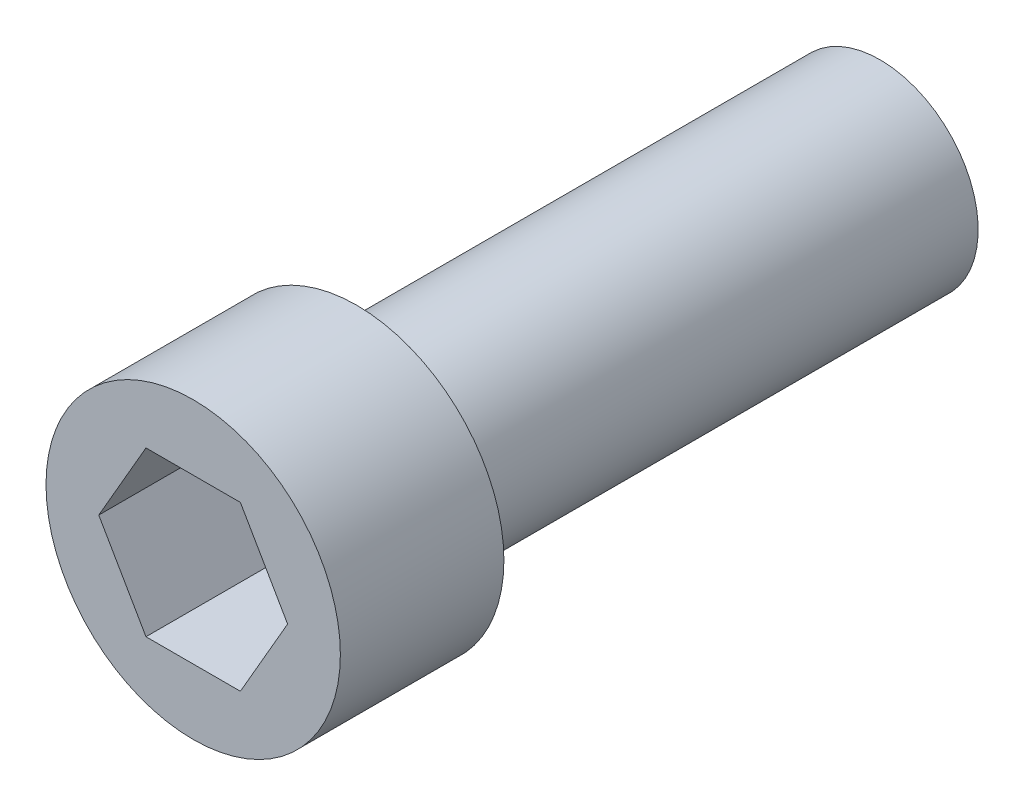
ISO-10303-21;
HEADER;
FILE_DESCRIPTION(('STEP AP214'),'2;1');
FILE_NAME('part.step','',(''),(''),'','','');
FILE_SCHEMA(('AUTOMOTIVE_DESIGN { 1 0 10303 214 1 1 1 1 }'));
ENDSEC;
DATA;
#1=APPLICATION_CONTEXT('core data for automotive mechanical design processes');
#2=APPLICATION_PROTOCOL_DEFINITION('international standard','automotive_design',2000,#1);
#3=PRODUCT_CONTEXT('',#1,'mechanical');
#4=PRODUCT('Part','Part','',(#3));
#5=PRODUCT_RELATED_PRODUCT_CATEGORY('part','',(#4));
#6=PRODUCT_DEFINITION_FORMATION('','',#4);
#7=PRODUCT_DEFINITION_CONTEXT('part definition',#1,'design');
#8=PRODUCT_DEFINITION('design','',#6,#7);
#9=PRODUCT_DEFINITION_SHAPE('','',#8);
#10=(LENGTH_UNIT() NAMED_UNIT(*) SI_UNIT(.MILLI.,.METRE.));
#11=(NAMED_UNIT(*) PLANE_ANGLE_UNIT() SI_UNIT($,.RADIAN.));
#12=(NAMED_UNIT(*) SI_UNIT($,.STERADIAN.) SOLID_ANGLE_UNIT());
#13=UNCERTAINTY_MEASURE_WITH_UNIT(LENGTH_MEASURE(1.E-05),#10,'distance_accuracy_value','');
#14=(GEOMETRIC_REPRESENTATION_CONTEXT(3) GLOBAL_UNCERTAINTY_ASSIGNED_CONTEXT((#13)) GLOBAL_UNIT_ASSIGNED_CONTEXT((#10,
#11,#12)) REPRESENTATION_CONTEXT('',''));
#15=CARTESIAN_POINT('',(0.,0.,0.));
#16=DIRECTION('',(0.,0.,1.));
#17=DIRECTION('',(1.,0.,0.));
#18=AXIS2_PLACEMENT_3D('',#15,#16,#17);
#19=CARTESIAN_POINT('',(0.,0.,2.5));
#20=DIRECTION('',(0.,0.,-1.));
#21=DIRECTION('',(-1.,0.,0.));
#22=AXIS2_PLACEMENT_3D('',#19,#20,#21);
#23=CYLINDRICAL_SURFACE('',#22,2.25);
#24=CARTESIAN_POINT('',(0.,0.,2.5));
#25=DIRECTION('',(0.,0.,1.));
#26=DIRECTION('',(1.,0.,0.));
#27=AXIS2_PLACEMENT_3D('',#24,#25,#26);
#28=CIRCLE('',#27,2.25);
#29=CARTESIAN_POINT('',(2.25,0.,2.5));
#30=VERTEX_POINT('',#29);
#31=EDGE_CURVE('E50',#30,#30,#28,.T.);
#32=ORIENTED_EDGE('',*,*,#31,.F.);
#33=EDGE_LOOP('',(#32));
#34=FACE_BOUND('',#33,.T.);
#35=CARTESIAN_POINT('',(0.,0.,0.));
#36=DIRECTION('',(0.,0.,1.));
#37=DIRECTION('',(1.,0.,0.));
#38=AXIS2_PLACEMENT_3D('',#35,#36,#37);
#39=CIRCLE('',#38,2.25);
#40=CARTESIAN_POINT('',(2.25,0.,0.));
#41=VERTEX_POINT('',#40);
#42=EDGE_CURVE('E44',#41,#41,#39,.T.);
#43=ORIENTED_EDGE('',*,*,#42,.T.);
#44=EDGE_LOOP('',(#43));
#45=FACE_BOUND('',#44,.T.);
#46=ADVANCED_FACE('F41',(#34,#45),#23,.T.);
#47=CARTESIAN_POINT('',(0.,0.,2.5));
#48=DIRECTION('',(0.,0.,1.));
#49=DIRECTION('',(1.,0.,0.));
#50=AXIS2_PLACEMENT_3D('',#47,#48,#49);
#51=PLANE('',#50);
#52=DIRECTION('',(0.499999999999999,0.866025403784439,0.));
#53=VECTOR('',#52,1.);
#54=CARTESIAN_POINT('',(0.721687836487032,-1.25,2.5));
#55=LINE('',#54,#53);
#56=CARTESIAN_POINT('',(0.721687836487032,-1.25,2.5));
#57=VERTEX_POINT('',#56);
#58=CARTESIAN_POINT('',(1.44337567297406,0.,2.5));
#59=VERTEX_POINT('',#58);
#60=EDGE_CURVE('E58',#57,#59,#55,.T.);
#61=ORIENTED_EDGE('',*,*,#60,.F.);
#62=DIRECTION('',(1.,0.,0.));
#63=VECTOR('',#62,1.);
#64=CARTESIAN_POINT('',(-0.721687836487033,-1.25,2.5));
#65=LINE('',#64,#63);
#66=CARTESIAN_POINT('',(-0.721687836487033,-1.25,2.5));
#67=VERTEX_POINT('',#66);
#68=EDGE_CURVE('E152',#67,#57,#65,.T.);
#69=ORIENTED_EDGE('',*,*,#68,.F.);
#70=DIRECTION('',(0.5,-0.866025403784439,0.));
#71=VECTOR('',#70,1.);
#72=CARTESIAN_POINT('',(-1.44337567297407,0.,2.5));
#73=LINE('',#72,#71);
#74=CARTESIAN_POINT('',(-1.44337567297407,0.,2.5));
#75=VERTEX_POINT('',#74);
#76=EDGE_CURVE('E149',#75,#67,#73,.T.);
#77=ORIENTED_EDGE('',*,*,#76,.F.);
#78=DIRECTION('',(-0.5,-0.866025403784439,0.));
#79=VECTOR('',#78,1.);
#80=CARTESIAN_POINT('',(-0.721687836487033,1.25,2.5));
#81=LINE('',#80,#79);
#82=CARTESIAN_POINT('',(-0.721687836487033,1.25,2.5));
#83=VERTEX_POINT('',#82);
#84=EDGE_CURVE('E106',#83,#75,#81,.T.);
#85=ORIENTED_EDGE('',*,*,#84,.F.);
#86=DIRECTION('',(-1.,0.,0.));
#87=VECTOR('',#86,1.);
#88=CARTESIAN_POINT('',(0.721687836487032,1.25,2.5));
#89=LINE('',#88,#87);
#90=CARTESIAN_POINT('',(0.721687836487032,1.25,2.5));
#91=VERTEX_POINT('',#90);
#92=EDGE_CURVE('E143',#91,#83,#89,.T.);
#93=ORIENTED_EDGE('',*,*,#92,.F.);
#94=DIRECTION('',(-0.5,0.866025403784439,0.));
#95=VECTOR('',#94,1.);
#96=CARTESIAN_POINT('',(1.44337567297406,0.,2.5));
#97=LINE('',#96,#95);
#98=EDGE_CURVE('E138',#59,#91,#97,.T.);
#99=ORIENTED_EDGE('',*,*,#98,.F.);
#100=EDGE_LOOP('',(#61,#69,#77,#85,#93,#99));
#101=FACE_BOUND('',#100,.T.);
#102=ORIENTED_EDGE('',*,*,#31,.T.);
#103=EDGE_LOOP('',(#102));
#104=FACE_BOUND('',#103,.T.);
#105=ADVANCED_FACE('F178',(#101,#104),#51,.T.);
#106=CARTESIAN_POINT('',(0.,0.,0.));
#107=DIRECTION('',(0.,0.,1.));
#108=DIRECTION('',(1.,0.,0.));
#109=AXIS2_PLACEMENT_3D('',#106,#107,#108);
#110=PLANE('',#109);
#111=CARTESIAN_POINT('',(0.,0.,0.));
#112=DIRECTION('',(0.,0.,-1.));
#113=DIRECTION('',(-1.,0.,0.));
#114=AXIS2_PLACEMENT_3D('',#111,#112,#113);
#115=CIRCLE('',#114,1.5);
#116=CARTESIAN_POINT('',(-1.5,0.,0.));
#117=VERTEX_POINT('',#116);
#118=EDGE_CURVE('E11',#117,#117,#115,.T.);
#119=ORIENTED_EDGE('',*,*,#118,.F.);
#120=EDGE_LOOP('',(#119));
#121=FACE_BOUND('',#120,.T.);
#122=ORIENTED_EDGE('',*,*,#42,.F.);
#123=EDGE_LOOP('',(#122));
#124=FACE_BOUND('',#123,.T.);
#125=ADVANCED_FACE('F175',(#121,#124),#110,.F.);
#126=CARTESIAN_POINT('',(0.721687836487032,-1.25,0.5));
#127=DIRECTION('',(0.866025403784439,-0.5,0.));
#128=DIRECTION('',(0.5,0.866025403784439,0.));
#129=AXIS2_PLACEMENT_3D('',#126,#127,#128);
#130=PLANE('',#129);
#131=ORIENTED_EDGE('',*,*,#60,.T.);
#132=DIRECTION('',(0.,0.,1.));
#133=VECTOR('',#132,1.);
#134=CARTESIAN_POINT('',(1.44337567297406,0.,0.5));
#135=LINE('',#134,#133);
#136=CARTESIAN_POINT('',(1.44337567297406,0.,0.5));
#137=VERTEX_POINT('',#136);
#138=EDGE_CURVE('E88',#137,#59,#135,.T.);
#139=ORIENTED_EDGE('',*,*,#138,.F.);
#140=DIRECTION('',(0.499999999999999,0.866025403784439,0.));
#141=VECTOR('',#140,1.);
#142=CARTESIAN_POINT('',(0.721687836487032,-1.25,0.5));
#143=LINE('',#142,#141);
#144=CARTESIAN_POINT('',(0.721687836487032,-1.25,0.5));
#145=VERTEX_POINT('',#144);
#146=EDGE_CURVE('E155',#145,#137,#143,.T.);
#147=ORIENTED_EDGE('',*,*,#146,.F.);
#148=DIRECTION('',(0.,0.,1.));
#149=VECTOR('',#148,1.);
#150=CARTESIAN_POINT('',(0.721687836487032,-1.25,0.5));
#151=LINE('',#150,#149);
#152=EDGE_CURVE('E66',#145,#57,#151,.T.);
#153=ORIENTED_EDGE('',*,*,#152,.T.);
#154=EDGE_LOOP('',(#131,#139,#147,#153));
#155=FACE_BOUND('',#154,.T.);
#156=ADVANCED_FACE('F177',(#155),#130,.F.);
#157=CARTESIAN_POINT('',(-0.721687836487033,-1.25,0.5));
#158=DIRECTION('',(0.,-1.,0.));
#159=DIRECTION('',(1.,0.,0.));
#160=AXIS2_PLACEMENT_3D('',#157,#158,#159);
#161=PLANE('',#160);
#162=ORIENTED_EDGE('',*,*,#68,.T.);
#163=ORIENTED_EDGE('',*,*,#152,.F.);
#164=DIRECTION('',(1.,0.,0.));
#165=VECTOR('',#164,1.);
#166=CARTESIAN_POINT('',(-0.721687836487033,-1.25,0.5));
#167=LINE('',#166,#165);
#168=CARTESIAN_POINT('',(-0.721687836487033,-1.25,0.5));
#169=VERTEX_POINT('',#168);
#170=EDGE_CURVE('E120',#169,#145,#167,.T.);
#171=ORIENTED_EDGE('',*,*,#170,.F.);
#172=DIRECTION('',(0.,0.,1.));
#173=VECTOR('',#172,1.);
#174=CARTESIAN_POINT('',(-0.721687836487033,-1.25,0.5));
#175=LINE('',#174,#173);
#176=EDGE_CURVE('E111',#169,#67,#175,.T.);
#177=ORIENTED_EDGE('',*,*,#176,.T.);
#178=EDGE_LOOP('',(#162,#163,#171,#177));
#179=FACE_BOUND('',#178,.T.);
#180=ADVANCED_FACE('F184',(#179),#161,.F.);
#181=CARTESIAN_POINT('',(-1.44337567297407,0.,0.5));
#182=DIRECTION('',(-0.866025403784439,-0.5,0.));
#183=DIRECTION('',(0.5,-0.866025403784439,0.));
#184=AXIS2_PLACEMENT_3D('',#181,#182,#183);
#185=PLANE('',#184);
#186=ORIENTED_EDGE('',*,*,#76,.T.);
#187=ORIENTED_EDGE('',*,*,#176,.F.);
#188=DIRECTION('',(0.5,-0.866025403784439,0.));
#189=VECTOR('',#188,1.);
#190=CARTESIAN_POINT('',(-1.44337567297407,0.,0.5));
#191=LINE('',#190,#189);
#192=CARTESIAN_POINT('',(-1.44337567297407,0.,0.5));
#193=VERTEX_POINT('',#192);
#194=EDGE_CURVE('E115',#193,#169,#191,.T.);
#195=ORIENTED_EDGE('',*,*,#194,.F.);
#196=DIRECTION('',(0.,0.,1.));
#197=VECTOR('',#196,1.);
#198=CARTESIAN_POINT('',(-1.44337567297407,0.,0.5));
#199=LINE('',#198,#197);
#200=EDGE_CURVE('E99',#193,#75,#199,.T.);
#201=ORIENTED_EDGE('',*,*,#200,.T.);
#202=EDGE_LOOP('',(#186,#187,#195,#201));
#203=FACE_BOUND('',#202,.T.);
#204=ADVANCED_FACE('F116',(#203),#185,.F.);
#205=CARTESIAN_POINT('',(-0.721687836487033,1.25,0.5));
#206=DIRECTION('',(-0.866025403784439,0.5,0.));
#207=DIRECTION('',(-0.5,-0.866025403784439,0.));
#208=AXIS2_PLACEMENT_3D('',#205,#206,#207);
#209=PLANE('',#208);
#210=ORIENTED_EDGE('',*,*,#84,.T.);
#211=ORIENTED_EDGE('',*,*,#200,.F.);
#212=DIRECTION('',(-0.5,-0.866025403784439,0.));
#213=VECTOR('',#212,1.);
#214=CARTESIAN_POINT('',(-0.721687836487033,1.25,0.5));
#215=LINE('',#214,#213);
#216=CARTESIAN_POINT('',(-0.721687836487033,1.25,0.5));
#217=VERTEX_POINT('',#216);
#218=EDGE_CURVE('E103',#217,#193,#215,.T.);
#219=ORIENTED_EDGE('',*,*,#218,.F.);
#220=DIRECTION('',(0.,0.,1.));
#221=VECTOR('',#220,1.);
#222=CARTESIAN_POINT('',(-0.721687836487033,1.25,0.5));
#223=LINE('',#222,#221);
#224=EDGE_CURVE('E112',#217,#83,#223,.T.);
#225=ORIENTED_EDGE('',*,*,#224,.T.);
#226=EDGE_LOOP('',(#210,#211,#219,#225));
#227=FACE_BOUND('',#226,.T.);
#228=ADVANCED_FACE('F101',(#227),#209,.F.);
#229=CARTESIAN_POINT('',(0.721687836487032,1.25,0.5));
#230=DIRECTION('',(0.,1.,0.));
#231=DIRECTION('',(0.,0.,1.));
#232=AXIS2_PLACEMENT_3D('',#229,#230,#231);
#233=PLANE('',#232);
#234=ORIENTED_EDGE('',*,*,#92,.T.);
#235=ORIENTED_EDGE('',*,*,#224,.F.);
#236=DIRECTION('',(-1.,0.,0.));
#237=VECTOR('',#236,1.);
#238=CARTESIAN_POINT('',(0.721687836487032,1.25,0.5));
#239=LINE('',#238,#237);
#240=CARTESIAN_POINT('',(0.721687836487032,1.25,0.5));
#241=VERTEX_POINT('',#240);
#242=EDGE_CURVE('E126',#241,#217,#239,.T.);
#243=ORIENTED_EDGE('',*,*,#242,.F.);
#244=DIRECTION('',(0.,0.,1.));
#245=VECTOR('',#244,1.);
#246=CARTESIAN_POINT('',(0.721687836487032,1.25,0.5));
#247=LINE('',#246,#245);
#248=EDGE_CURVE('E162',#241,#91,#247,.T.);
#249=ORIENTED_EDGE('',*,*,#248,.T.);
#250=EDGE_LOOP('',(#234,#235,#243,#249));
#251=FACE_BOUND('',#250,.T.);
#252=ADVANCED_FACE('F229',(#251),#233,.F.);
#253=CARTESIAN_POINT('',(1.44337567297406,0.,0.5));
#254=DIRECTION('',(0.866025403784439,0.5,0.));
#255=DIRECTION('',(-0.5,0.866025403784439,0.));
#256=AXIS2_PLACEMENT_3D('',#253,#254,#255);
#257=PLANE('',#256);
#258=ORIENTED_EDGE('',*,*,#98,.T.);
#259=ORIENTED_EDGE('',*,*,#248,.F.);
#260=DIRECTION('',(-0.5,0.866025403784439,0.));
#261=VECTOR('',#260,1.);
#262=CARTESIAN_POINT('',(1.44337567297406,0.,0.5));
#263=LINE('',#262,#261);
#264=EDGE_CURVE('E130',#137,#241,#263,.T.);
#265=ORIENTED_EDGE('',*,*,#264,.F.);
#266=ORIENTED_EDGE('',*,*,#138,.T.);
#267=EDGE_LOOP('',(#258,#259,#265,#266));
#268=FACE_BOUND('',#267,.T.);
#269=ADVANCED_FACE('F238',(#268),#257,.F.);
#270=CARTESIAN_POINT('',(0.,0.,0.5));
#271=DIRECTION('',(0.,0.,1.));
#272=DIRECTION('',(1.,0.,0.));
#273=AXIS2_PLACEMENT_3D('',#270,#271,#272);
#274=PLANE('',#273);
#275=ORIENTED_EDGE('',*,*,#146,.T.);
#276=ORIENTED_EDGE('',*,*,#264,.T.);
#277=ORIENTED_EDGE('',*,*,#242,.T.);
#278=ORIENTED_EDGE('',*,*,#218,.T.);
#279=ORIENTED_EDGE('',*,*,#194,.T.);
#280=ORIENTED_EDGE('',*,*,#170,.T.);
#281=EDGE_LOOP('',(#275,#276,#277,#278,#279,#280));
#282=FACE_BOUND('',#281,.T.);
#283=ADVANCED_FACE('F123',(#282),#274,.T.);
#284=CARTESIAN_POINT('',(0.,0.,-8.));
#285=DIRECTION('',(0.,0.,1.));
#286=DIRECTION('',(1.,0.,0.));
#287=AXIS2_PLACEMENT_3D('',#284,#285,#286);
#288=CYLINDRICAL_SURFACE('',#287,1.5);
#289=CARTESIAN_POINT('',(0.,0.,-8.));
#290=DIRECTION('',(0.,0.,-1.));
#291=DIRECTION('',(-1.,0.,0.));
#292=AXIS2_PLACEMENT_3D('',#289,#290,#291);
#293=CIRCLE('',#292,1.5);
#294=CARTESIAN_POINT('',(-1.5,0.,-8.));
#295=VERTEX_POINT('',#294);
#296=EDGE_CURVE('E139',#295,#295,#293,.T.);
#297=ORIENTED_EDGE('',*,*,#296,.F.);
#298=EDGE_LOOP('',(#297));
#299=FACE_BOUND('',#298,.T.);
#300=ORIENTED_EDGE('',*,*,#118,.T.);
#301=EDGE_LOOP('',(#300));
#302=FACE_BOUND('',#301,.T.);
#303=ADVANCED_FACE('F256',(#299,#302),#288,.T.);
#304=CARTESIAN_POINT('',(0.,0.,-8.));
#305=DIRECTION('',(0.,0.,-1.));
#306=DIRECTION('',(-1.,0.,0.));
#307=AXIS2_PLACEMENT_3D('',#304,#305,#306);
#308=PLANE('',#307);
#309=ORIENTED_EDGE('',*,*,#296,.T.);
#310=EDGE_LOOP('',(#309));
#311=FACE_BOUND('',#310,.T.);
#312=ADVANCED_FACE('F269',(#311),#308,.T.);
#313=CLOSED_SHELL('',(#46,#105,#125,#156,#180,#204,#228,#252,#269,#283,#303,#312));
#314=MANIFOLD_SOLID_BREP('B2',#313);
#315=ADVANCED_BREP_SHAPE_REPRESENTATION('',(#18,#314),#14);
#316=SHAPE_DEFINITION_REPRESENTATION(#9,#315);
ENDSEC;
END-ISO-10303-21;
